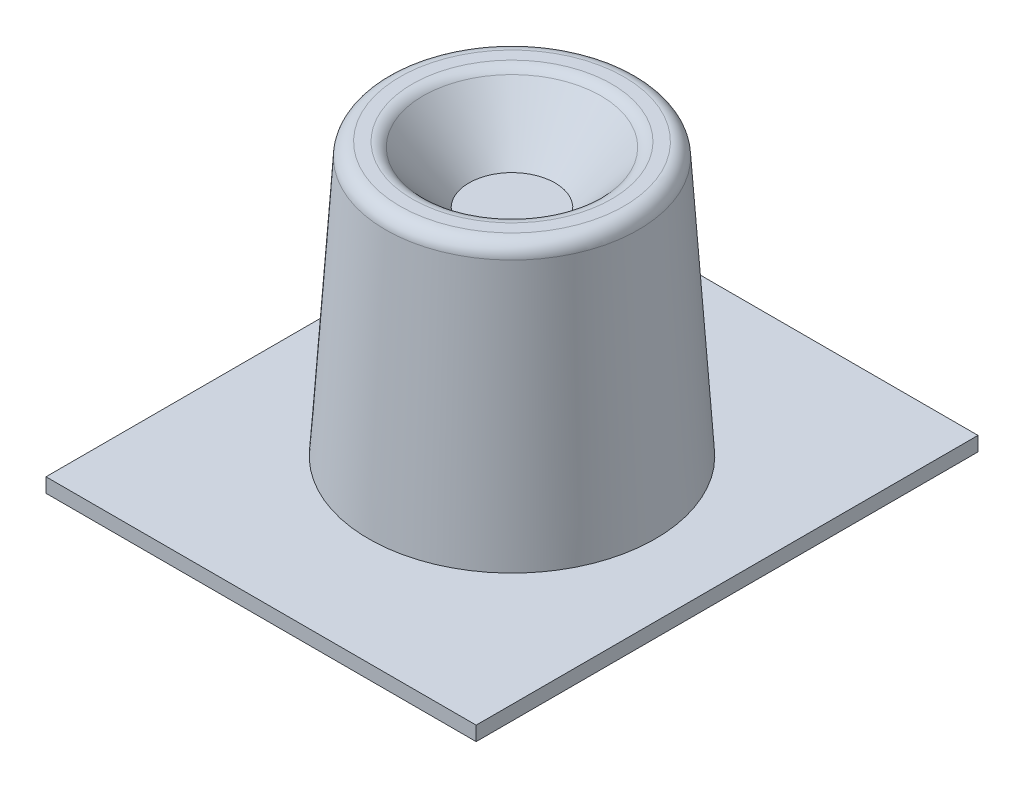
ISO-10303-21;
HEADER;
FILE_DESCRIPTION(('STEP AP214'),'2;1');
FILE_NAME('part.step','',(''),(''),'','','');
FILE_SCHEMA(('AUTOMOTIVE_DESIGN { 1 0 10303 214 1 1 1 1 }'));
ENDSEC;
DATA;
#1=APPLICATION_CONTEXT('core data for automotive mechanical design processes');
#2=APPLICATION_PROTOCOL_DEFINITION('international standard','automotive_design',2000,#1);
#3=PRODUCT_CONTEXT('',#1,'mechanical');
#4=PRODUCT('Part','Part','',(#3));
#5=PRODUCT_RELATED_PRODUCT_CATEGORY('part','',(#4));
#6=PRODUCT_DEFINITION_FORMATION('','',#4);
#7=PRODUCT_DEFINITION_CONTEXT('part definition',#1,'design');
#8=PRODUCT_DEFINITION('design','',#6,#7);
#9=PRODUCT_DEFINITION_SHAPE('','',#8);
#10=(LENGTH_UNIT() NAMED_UNIT(*) SI_UNIT(.MILLI.,.METRE.));
#11=(NAMED_UNIT(*) PLANE_ANGLE_UNIT() SI_UNIT($,.RADIAN.));
#12=(NAMED_UNIT(*) SI_UNIT($,.STERADIAN.) SOLID_ANGLE_UNIT());
#13=UNCERTAINTY_MEASURE_WITH_UNIT(LENGTH_MEASURE(1.E-05),#10,'distance_accuracy_value','');
#14=(GEOMETRIC_REPRESENTATION_CONTEXT(3) GLOBAL_UNCERTAINTY_ASSIGNED_CONTEXT((#13)) GLOBAL_UNIT_ASSIGNED_CONTEXT((#10,
#11,#12)) REPRESENTATION_CONTEXT('',''));
#15=CARTESIAN_POINT('',(0.,0.,0.));
#16=DIRECTION('',(0.,0.,1.));
#17=DIRECTION('',(1.,0.,0.));
#18=AXIS2_PLACEMENT_3D('',#15,#16,#17);
#19=CARTESIAN_POINT('',(2.35922392732846E-13,19.1361272347541,0.));
#20=DIRECTION('',(0.,1.,0.));
#21=DIRECTION('',(0.,0.,1.));
#22=AXIS2_PLACEMENT_3D('',#19,#20,#21);
#23=PLANE('',#22);
#24=CARTESIAN_POINT('',(2.35922392732846E-13,19.1361272347541,0.));
#25=DIRECTION('',(0.,-1.,0.));
#26=DIRECTION('',(0.,0.,-1.));
#27=AXIS2_PLACEMENT_3D('',#24,#25,#26);
#28=CIRCLE('',#27,3.);
#29=CARTESIAN_POINT('',(2.43915998510147E-13,19.1361272347541,-3.00000000000004));
#30=VERTEX_POINT('',#29);
#31=EDGE_CURVE('E116',#30,#30,#28,.T.);
#32=ORIENTED_EDGE('',*,*,#31,.F.);
#33=EDGE_LOOP('',(#32));
#34=FACE_BOUND('',#33,.T.);
#35=ADVANCED_FACE('F36',(#34),#23,.T.);
#36=CARTESIAN_POINT('',(2.35922392732846E-13,23.1361272347541,0.));
#37=DIRECTION('',(0.,1.,0.));
#38=DIRECTION('',(0.,0.,1.));
#39=AXIS2_PLACEMENT_3D('',#36,#37,#38);
#40=CONICAL_SURFACE('',#39,6.5,0.718829999621625);
#41=CARTESIAN_POINT('',(2.35922392732846E-13,22.7946318426226,0.));
#42=DIRECTION('',(0.,-1.,0.));
#43=DIRECTION('',(0.,0.,-1.));
#44=AXIS2_PLACEMENT_3D('',#41,#42,#43);
#45=CIRCLE('',#44,6.20119153188495);
#46=CARTESIAN_POINT('',(2.52445686217988E-13,22.7946318426226,-6.20119153188499));
#47=VERTEX_POINT('',#46);
#48=EDGE_CURVE('E11',#47,#47,#45,.F.);
#49=ORIENTED_EDGE('',*,*,#48,.T.);
#50=EDGE_LOOP('',(#49));
#51=FACE_BOUND('',#50,.T.);
#52=ORIENTED_EDGE('',*,*,#31,.T.);
#53=EDGE_LOOP('',(#52));
#54=FACE_BOUND('',#53,.T.);
#55=ADVANCED_FACE('F158',(#51,#54),#40,.F.);
#56=CARTESIAN_POINT('',(6.50000000000047,23.1361272347542,0.));
#57=DIRECTION('',(0.,1.,0.));
#58=DIRECTION('',(0.,0.,1.));
#59=AXIS2_PLACEMENT_3D('',#56,#57,#58);
#60=PLANE('',#59);
#61=CARTESIAN_POINT('',(2.35922392732846E-13,23.1361272347541,0.));
#62=DIRECTION('',(0.,1.,0.));
#63=DIRECTION('',(0.,0.,1.));
#64=AXIS2_PLACEMENT_3D('',#61,#62,#63);
#65=CIRCLE('',#64,7.81362768293002);
#66=CARTESIAN_POINT('',(2.15102706270196E-13,23.1361272347541,7.81362768292998));
#67=VERTEX_POINT('',#66);
#68=EDGE_CURVE('E45',#67,#67,#65,.T.);
#69=ORIENTED_EDGE('',*,*,#68,.T.);
#70=EDGE_LOOP('',(#69));
#71=FACE_BOUND('',#70,.T.);
#72=CARTESIAN_POINT('',(2.35922392732846E-13,23.1361272347541,0.));
#73=DIRECTION('',(0.,1.,0.));
#74=DIRECTION('',(0.,0.,1.));
#75=AXIS2_PLACEMENT_3D('',#72,#73,#74);
#76=CIRCLE('',#75,6.95376822659183);
#77=CARTESIAN_POINT('',(2.1739383210948E-13,23.1361272347541,6.95376822659178));
#78=VERTEX_POINT('',#77);
#79=EDGE_CURVE('E122',#78,#78,#76,.F.);
#80=ORIENTED_EDGE('',*,*,#79,.T.);
#81=EDGE_LOOP('',(#80));
#82=FACE_BOUND('',#81,.T.);
#83=ADVANCED_FACE('F127',(#71,#82),#60,.T.);
#84=CARTESIAN_POINT('',(0.,4.13612723475407,0.));
#85=DIRECTION('',(0.,-1.,0.));
#86=DIRECTION('',(0.,0.,-1.));
#87=AXIS2_PLACEMENT_3D('',#84,#85,#86);
#88=CONICAL_SURFACE('',#87,10.,0.0656948015524647);
#89=CARTESIAN_POINT('',(2.35922392732846E-13,22.2017747921557,0.));
#90=DIRECTION('',(0.,1.,0.));
#91=DIRECTION('',(0.,0.,1.));
#92=AXIS2_PLACEMENT_3D('',#89,#90,#91);
#93=CIRCLE('',#92,8.81147055543411);
#94=CARTESIAN_POINT('',(2.12443918753366E-13,22.2017747921557,8.81147055543406));
#95=VERTEX_POINT('',#94);
#96=EDGE_CURVE('E119',#95,#95,#93,.F.);
#97=ORIENTED_EDGE('',*,*,#96,.T.);
#98=EDGE_LOOP('',(#97));
#99=FACE_BOUND('',#98,.T.);
#100=CARTESIAN_POINT('',(0.,4.13612723475407,0.));
#101=DIRECTION('',(0.,-1.,0.));
#102=DIRECTION('',(0.,0.,-1.));
#103=AXIS2_PLACEMENT_3D('',#100,#101,#102);
#104=CIRCLE('',#103,10.);
#105=CARTESIAN_POINT('',(1.23789867245705E-13,4.13612723475408,-10.));
#106=VERTEX_POINT('',#105);
#107=EDGE_CURVE('E113',#106,#106,#104,.T.);
#108=ORIENTED_EDGE('',*,*,#107,.F.);
#109=EDGE_LOOP('',(#108));
#110=FACE_BOUND('',#109,.T.);
#111=ADVANCED_FACE('F133',(#99,#110),#88,.T.);
#112=CARTESIAN_POINT('',(2.35922392732846E-13,22.1361272347541,0.));
#113=DIRECTION('',(0.,1.,0.));
#114=DIRECTION('',(0.,0.,1.));
#115=AXIS2_PLACEMENT_3D('',#112,#113,#114);
#116=TOROIDAL_SURFACE('',#115,7.81362768293002,1.);
#117=ORIENTED_EDGE('',*,*,#68,.F.);
#118=EDGE_LOOP('',(#117));
#119=FACE_BOUND('',#118,.T.);
#120=ORIENTED_EDGE('',*,*,#96,.F.);
#121=EDGE_LOOP('',(#120));
#122=FACE_BOUND('',#121,.T.);
#123=ADVANCED_FACE('F130',(#119,#122),#116,.T.);
#124=CARTESIAN_POINT('',(2.35922392732846E-13,22.1361272347541,0.));
#125=DIRECTION('',(0.,1.,0.));
#126=DIRECTION('',(0.,0.,1.));
#127=AXIS2_PLACEMENT_3D('',#124,#125,#126);
#128=TOROIDAL_SURFACE('',#127,6.95376822659183,1.);
#129=ORIENTED_EDGE('',*,*,#48,.F.);
#130=EDGE_LOOP('',(#129));
#131=FACE_BOUND('',#130,.T.);
#132=ORIENTED_EDGE('',*,*,#79,.F.);
#133=EDGE_LOOP('',(#132));
#134=FACE_BOUND('',#133,.T.);
#135=ADVANCED_FACE('F38',(#131,#134),#128,.T.);
#136=CARTESIAN_POINT('',(15.0000000000002,3.1361272347542,-17.5000000000001));
#137=DIRECTION('',(-1.00000000000002,0.,0.));
#138=DIRECTION('',(0.,0.,1.));
#139=AXIS2_PLACEMENT_3D('',#136,#137,#138);
#140=PLANE('',#139);
#141=DIRECTION('',(0.,0.,1.));
#142=VECTOR('',#141,1.);
#143=CARTESIAN_POINT('',(15.0000000000002,4.13612723475419,-17.5000000000001));
#144=LINE('',#143,#142);
#145=CARTESIAN_POINT('',(15.0000000000002,4.13612723475419,-17.5000000000001));
#146=VERTEX_POINT('',#145);
#147=CARTESIAN_POINT('',(15.,4.13612723475411,17.4999999999999));
#148=VERTEX_POINT('',#147);
#149=EDGE_CURVE('E104',#146,#148,#144,.T.);
#150=ORIENTED_EDGE('',*,*,#149,.T.);
#151=DIRECTION('',(0.,1.,0.));
#152=VECTOR('',#151,1.);
#153=CARTESIAN_POINT('',(15.,3.13612723475411,17.4999999999999));
#154=LINE('',#153,#152);
#155=CARTESIAN_POINT('',(15.,3.13612723475411,17.4999999999999));
#156=VERTEX_POINT('',#155);
#157=EDGE_CURVE('E95',#156,#148,#154,.T.);
#158=ORIENTED_EDGE('',*,*,#157,.F.);
#159=DIRECTION('',(0.,0.,1.));
#160=VECTOR('',#159,1.);
#161=CARTESIAN_POINT('',(15.0000000000002,3.1361272347542,-17.5000000000001));
#162=LINE('',#161,#160);
#163=CARTESIAN_POINT('',(15.0000000000002,3.1361272347542,-17.5000000000001));
#164=VERTEX_POINT('',#163);
#165=EDGE_CURVE('E89',#164,#156,#162,.T.);
#166=ORIENTED_EDGE('',*,*,#165,.F.);
#167=DIRECTION('',(0.,1.,0.));
#168=VECTOR('',#167,1.);
#169=CARTESIAN_POINT('',(15.0000000000002,3.1361272347542,-17.5000000000001));
#170=LINE('',#169,#168);
#171=EDGE_CURVE('E100',#164,#146,#170,.T.);
#172=ORIENTED_EDGE('',*,*,#171,.T.);
#173=EDGE_LOOP('',(#150,#158,#166,#172));
#174=FACE_BOUND('',#173,.T.);
#175=ADVANCED_FACE('F147',(#174),#140,.F.);
#176=CARTESIAN_POINT('',(15.,3.13612723475411,17.4999999999999));
#177=DIRECTION('',(0.,0.,-1.));
#178=DIRECTION('',(-1.00000000000002,0.,0.));
#179=AXIS2_PLACEMENT_3D('',#176,#177,#178);
#180=PLANE('',#179);
#181=DIRECTION('',(-1.00000000000002,0.,0.));
#182=VECTOR('',#181,1.);
#183=CARTESIAN_POINT('',(15.,4.13612723475411,17.4999999999999));
#184=LINE('',#183,#182);
#185=CARTESIAN_POINT('',(-15.0000000000006,4.1361272347539,17.5));
#186=VERTEX_POINT('',#185);
#187=EDGE_CURVE('E94',#148,#186,#184,.T.);
#188=ORIENTED_EDGE('',*,*,#187,.T.);
#189=DIRECTION('',(0.,1.,0.));
#190=VECTOR('',#189,1.);
#191=CARTESIAN_POINT('',(-15.0000000000006,3.13612723475389,17.5));
#192=LINE('',#191,#190);
#193=CARTESIAN_POINT('',(-15.0000000000006,3.13612723475389,17.5));
#194=VERTEX_POINT('',#193);
#195=EDGE_CURVE('E92',#194,#186,#192,.T.);
#196=ORIENTED_EDGE('',*,*,#195,.F.);
#197=DIRECTION('',(-1.00000000000002,0.,0.));
#198=VECTOR('',#197,1.);
#199=CARTESIAN_POINT('',(15.,3.13612723475411,17.4999999999999));
#200=LINE('',#199,#198);
#201=EDGE_CURVE('E84',#156,#194,#200,.T.);
#202=ORIENTED_EDGE('',*,*,#201,.F.);
#203=ORIENTED_EDGE('',*,*,#157,.T.);
#204=EDGE_LOOP('',(#188,#196,#202,#203));
#205=FACE_BOUND('',#204,.T.);
#206=ADVANCED_FACE('F93',(#205),#180,.F.);
#207=CARTESIAN_POINT('',(-15.0000000000004,3.13612723475398,-17.5000000000001));
#208=DIRECTION('',(1.00000000000002,0.,0.));
#209=DIRECTION('',(0.,0.,-1.));
#210=AXIS2_PLACEMENT_3D('',#207,#208,#209);
#211=PLANE('',#210);
#212=DIRECTION('',(0.,0.,-1.));
#213=VECTOR('',#212,1.);
#214=CARTESIAN_POINT('',(-15.0000000000004,4.13612723475398,-17.5000000000001));
#215=LINE('',#214,#213);
#216=CARTESIAN_POINT('',(-15.0000000000004,4.13612723475398,-17.5000000000001));
#217=VERTEX_POINT('',#216);
#218=EDGE_CURVE('E70',#186,#217,#215,.T.);
#219=ORIENTED_EDGE('',*,*,#218,.T.);
#220=DIRECTION('',(0.,1.,0.));
#221=VECTOR('',#220,1.);
#222=CARTESIAN_POINT('',(-15.0000000000004,3.13612723475398,-17.5000000000001));
#223=LINE('',#222,#221);
#224=CARTESIAN_POINT('',(-15.0000000000004,3.13612723475398,-17.5000000000001));
#225=VERTEX_POINT('',#224);
#226=EDGE_CURVE('E96',#225,#217,#223,.T.);
#227=ORIENTED_EDGE('',*,*,#226,.F.);
#228=DIRECTION('',(0.,0.,-1.));
#229=VECTOR('',#228,1.);
#230=CARTESIAN_POINT('',(-15.0000000000004,3.13612723475398,-17.5000000000001));
#231=LINE('',#230,#229);
#232=EDGE_CURVE('E87',#194,#225,#231,.T.);
#233=ORIENTED_EDGE('',*,*,#232,.F.);
#234=ORIENTED_EDGE('',*,*,#195,.T.);
#235=EDGE_LOOP('',(#219,#227,#233,#234));
#236=FACE_BOUND('',#235,.T.);
#237=ADVANCED_FACE('F98',(#236),#211,.F.);
#238=CARTESIAN_POINT('',(15.0000000000002,3.1361272347542,-17.5000000000001));
#239=DIRECTION('',(0.,0.,1.));
#240=DIRECTION('',(1.00000000000002,0.,0.));
#241=AXIS2_PLACEMENT_3D('',#238,#239,#240);
#242=PLANE('',#241);
#243=DIRECTION('',(1.00000000000002,0.,0.));
#244=VECTOR('',#243,1.);
#245=CARTESIAN_POINT('',(15.0000000000002,4.13612723475419,-17.5000000000001));
#246=LINE('',#245,#244);
#247=EDGE_CURVE('E76',#217,#146,#246,.T.);
#248=ORIENTED_EDGE('',*,*,#247,.T.);
#249=ORIENTED_EDGE('',*,*,#171,.F.);
#250=DIRECTION('',(1.00000000000002,0.,0.));
#251=VECTOR('',#250,1.);
#252=CARTESIAN_POINT('',(15.0000000000002,3.1361272347542,-17.5000000000001));
#253=LINE('',#252,#251);
#254=EDGE_CURVE('E53',#225,#164,#253,.T.);
#255=ORIENTED_EDGE('',*,*,#254,.F.);
#256=ORIENTED_EDGE('',*,*,#226,.T.);
#257=EDGE_LOOP('',(#248,#249,#255,#256));
#258=FACE_BOUND('',#257,.T.);
#259=ADVANCED_FACE('F148',(#258),#242,.F.);
#260=CARTESIAN_POINT('',(15.,3.13612723475411,17.4999999999999));
#261=DIRECTION('',(0.,-1.,0.));
#262=DIRECTION('',(0.,0.,-1.));
#263=AXIS2_PLACEMENT_3D('',#260,#261,#262);
#264=PLANE('',#263);
#265=ORIENTED_EDGE('',*,*,#165,.T.);
#266=ORIENTED_EDGE('',*,*,#201,.T.);
#267=ORIENTED_EDGE('',*,*,#232,.T.);
#268=ORIENTED_EDGE('',*,*,#254,.T.);
#269=EDGE_LOOP('',(#265,#266,#267,#268));
#270=FACE_BOUND('',#269,.T.);
#271=ADVANCED_FACE('F85',(#270),#264,.T.);
#272=CARTESIAN_POINT('',(15.,4.13612723475411,17.4999999999999));
#273=DIRECTION('',(0.,-1.,0.));
#274=DIRECTION('',(0.,0.,-1.));
#275=AXIS2_PLACEMENT_3D('',#272,#273,#274);
#276=PLANE('',#275);
#277=ORIENTED_EDGE('',*,*,#107,.T.);
#278=EDGE_LOOP('',(#277));
#279=FACE_BOUND('',#278,.T.);
#280=ORIENTED_EDGE('',*,*,#149,.F.);
#281=ORIENTED_EDGE('',*,*,#247,.F.);
#282=ORIENTED_EDGE('',*,*,#218,.F.);
#283=ORIENTED_EDGE('',*,*,#187,.F.);
#284=EDGE_LOOP('',(#280,#281,#282,#283));
#285=FACE_BOUND('',#284,.T.);
#286=ADVANCED_FACE('F141',(#279,#285),#276,.F.);
#287=CLOSED_SHELL('',(#35,#55,#83,#111,#123,#135,#175,#206,#237,#259,#271,#286));
#288=MANIFOLD_SOLID_BREP('B2',#287);
#289=ADVANCED_BREP_SHAPE_REPRESENTATION('',(#18,#288),#14);
#290=SHAPE_DEFINITION_REPRESENTATION(#9,#289);
ENDSEC;
END-ISO-10303-21;
